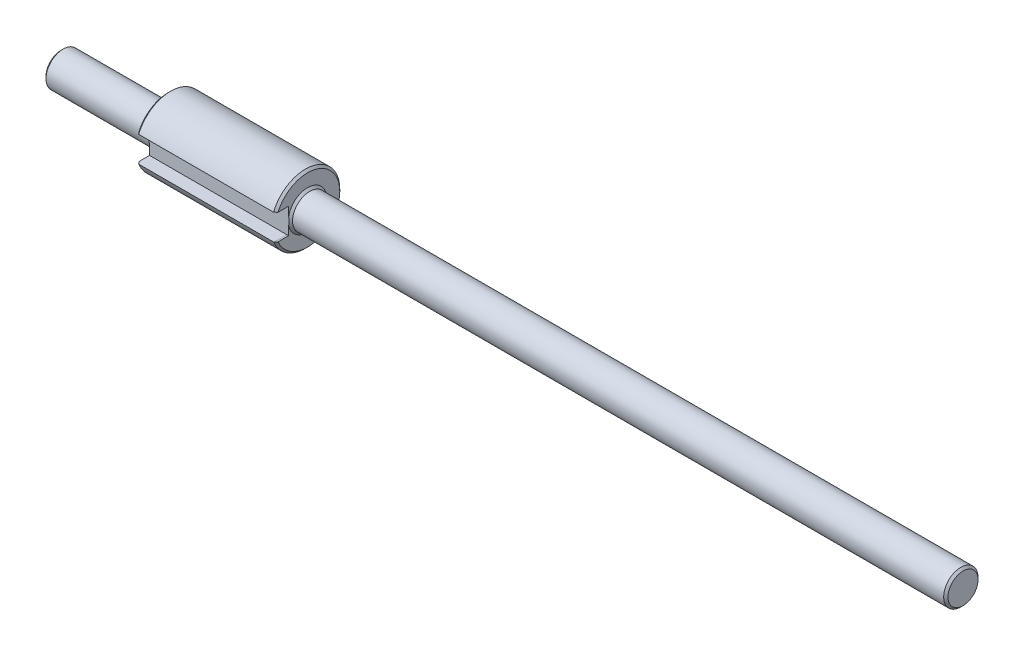
ISO-10303-21;
HEADER;
FILE_DESCRIPTION(('STEP AP214'),'2;1');
FILE_NAME('part.step','',(''),(''),'','','');
FILE_SCHEMA(('AUTOMOTIVE_DESIGN { 1 0 10303 214 1 1 1 1 }'));
ENDSEC;
DATA;
#1=APPLICATION_CONTEXT('core data for automotive mechanical design processes');
#2=APPLICATION_PROTOCOL_DEFINITION('international standard','automotive_design',2000,#1);
#3=PRODUCT_CONTEXT('',#1,'mechanical');
#4=PRODUCT('Part','Part','',(#3));
#5=PRODUCT_RELATED_PRODUCT_CATEGORY('part','',(#4));
#6=PRODUCT_DEFINITION_FORMATION('','',#4);
#7=PRODUCT_DEFINITION_CONTEXT('part definition',#1,'design');
#8=PRODUCT_DEFINITION('design','',#6,#7);
#9=PRODUCT_DEFINITION_SHAPE('','',#8);
#10=(LENGTH_UNIT() NAMED_UNIT(*) SI_UNIT(.MILLI.,.METRE.));
#11=(NAMED_UNIT(*) PLANE_ANGLE_UNIT() SI_UNIT($,.RADIAN.));
#12=(NAMED_UNIT(*) SI_UNIT($,.STERADIAN.) SOLID_ANGLE_UNIT());
#13=UNCERTAINTY_MEASURE_WITH_UNIT(LENGTH_MEASURE(1.E-05),#10,'distance_accuracy_value','');
#14=(GEOMETRIC_REPRESENTATION_CONTEXT(3) GLOBAL_UNCERTAINTY_ASSIGNED_CONTEXT((#13)) GLOBAL_UNIT_ASSIGNED_CONTEXT((#10,
#11,#12)) REPRESENTATION_CONTEXT('',''));
#15=CARTESIAN_POINT('',(0.,0.,0.));
#16=DIRECTION('',(0.,0.,1.));
#17=DIRECTION('',(1.,0.,0.));
#18=AXIS2_PLACEMENT_3D('',#15,#16,#17);
#19=CARTESIAN_POINT('',(11.5,0.,2.2));
#20=DIRECTION('',(0.,0.,1.));
#21=DIRECTION('',(1.,0.,0.));
#22=AXIS2_PLACEMENT_3D('',#19,#20,#21);
#23=PLANE('',#22);
#24=DIRECTION('',(-1.,0.,0.));
#25=VECTOR('',#24,1.);
#26=CARTESIAN_POINT('',(28.5,1.5,2.2));
#27=LINE('',#26,#25);
#28=CARTESIAN_POINT('',(28.5,1.5,2.2));
#29=VERTEX_POINT('',#28);
#30=CARTESIAN_POINT('',(12.5,1.5,2.2));
#31=VERTEX_POINT('',#30);
#32=EDGE_CURVE('E207',#29,#31,#27,.T.);
#33=ORIENTED_EDGE('',*,*,#32,.T.);
#34=DIRECTION('',(0.,-1.,0.));
#35=VECTOR('',#34,1.);
#36=CARTESIAN_POINT('',(12.5,0.,2.2));
#37=LINE('',#36,#35);
#38=CARTESIAN_POINT('',(12.5,0.471699056602839,2.2));
#39=VERTEX_POINT('',#38);
#40=EDGE_CURVE('E177',#31,#39,#37,.T.);
#41=ORIENTED_EDGE('',*,*,#40,.T.);
#42=CARTESIAN_POINT('',(12.5,0.471699056602839,2.2));
#43=CARTESIAN_POINT('',(12.4884661641308,0.416797253813431,2.2));
#44=CARTESIAN_POINT('',(12.4788132845891,0.36148243843863,2.2));
#45=CARTESIAN_POINT('',(12.4635114340834,0.250276403978719,2.2));
#46=CARTESIAN_POINT('',(12.4578644414236,0.194384913906684,2.2));
#47=CARTESIAN_POINT('',(12.4508818824775,0.0831843134871501,2.2));
#48=CARTESIAN_POINT('',(12.4494818797254,0.0278793202469923,2.2));
#49=CARTESIAN_POINT('',(12.4508590342781,-0.0826530499453649,2.2));
#50=CARTESIAN_POINT('',(12.453634210324,-0.13788045127162,2.2));
#51=CARTESIAN_POINT('',(12.4625202874015,-0.239598348395322,2.2));
#52=CARTESIAN_POINT('',(12.4680597454246,-0.286140311064404,2.2));
#53=CARTESIAN_POINT('',(12.4819478803714,-0.379117623241041,2.2));
#54=CARTESIAN_POINT('',(12.4903147919314,-0.425550258810649,2.2));
#55=CARTESIAN_POINT('',(12.5,-0.471699056602839,2.2));
#56=B_SPLINE_CURVE_WITH_KNOTS('',3,(#42,#43,#44,#45,#46,#47,#48,#49,#50,#51,#52,#53,#54,#55),
.UNSPECIFIED.,.F.,.F.,(4,2,2,2,2,2,4),(0.,0.168294691823436,0.336672438105486,0.502482403731017,
0.668213711920876,0.808742158040954,0.950194758246139),.UNSPECIFIED.);
#57=CARTESIAN_POINT('',(12.5,-0.471699056602839,2.2));
#58=VERTEX_POINT('',#57);
#59=EDGE_CURVE('E11',#39,#58,#56,.T.);
#60=ORIENTED_EDGE('',*,*,#59,.T.);
#61=CARTESIAN_POINT('',(12.5,-1.5,2.2));
#62=VERTEX_POINT('',#61);
#63=EDGE_CURVE('E141',#58,#62,#37,.T.);
#64=ORIENTED_EDGE('',*,*,#63,.T.);
#65=DIRECTION('',(1.,0.,0.));
#66=VECTOR('',#65,1.);
#67=CARTESIAN_POINT('',(11.5,-1.5,2.2));
#68=LINE('',#67,#66);
#69=CARTESIAN_POINT('',(28.5,-1.5,2.2));
#70=VERTEX_POINT('',#69);
#71=EDGE_CURVE('E157',#62,#70,#68,.T.);
#72=ORIENTED_EDGE('',*,*,#71,.T.);
#73=CARTESIAN_POINT('',(28.5,0.,2.2));
#74=DIRECTION('',(0.,0.,1.));
#75=DIRECTION('',(0.,-1.,0.));
#76=AXIS2_PLACEMENT_3D('',#73,#74,#75);
#77=CIRCLE('',#76,1.5);
#78=CARTESIAN_POINT('',(28.7,-1.48660687473185,2.2));
#79=VERTEX_POINT('',#78);
#80=EDGE_CURVE('E148',#70,#79,#77,.T.);
#81=ORIENTED_EDGE('',*,*,#80,.T.);
#82=DIRECTION('',(0.,1.,0.));
#83=VECTOR('',#82,1.);
#84=CARTESIAN_POINT('',(28.7,0.,2.2));
#85=LINE('',#84,#83);
#86=CARTESIAN_POINT('',(28.7,-0.471699056602906,2.2));
#87=VERTEX_POINT('',#86);
#88=EDGE_CURVE('E133',#79,#87,#85,.T.);
#89=ORIENTED_EDGE('',*,*,#88,.T.);
#90=CARTESIAN_POINT('',(28.7,-0.471699056602906,2.2));
#91=CARTESIAN_POINT('',(28.7115338358692,-0.416797253813498,2.2));
#92=CARTESIAN_POINT('',(28.7211867154109,-0.361482438438698,2.2));
#93=CARTESIAN_POINT('',(28.7364885659166,-0.250276403978788,2.2));
#94=CARTESIAN_POINT('',(28.7421355585764,-0.194384913906754,2.2));
#95=CARTESIAN_POINT('',(28.7491181175225,-0.0831843134872213,2.2));
#96=CARTESIAN_POINT('',(28.7505181202746,-0.0278793202470641,2.2));
#97=CARTESIAN_POINT('',(28.7491409657219,0.0826530499452922,2.2));
#98=CARTESIAN_POINT('',(28.746365789676,0.137880451271547,2.2));
#99=CARTESIAN_POINT('',(28.7374797125985,0.239598348395272,2.2));
#100=CARTESIAN_POINT('',(28.7319402545755,0.286140311064377,2.2));
#101=CARTESIAN_POINT('',(28.7180521196287,0.379117623241061,2.2));
#102=CARTESIAN_POINT('',(28.7096852080686,0.425550258810693,2.2));
#103=CARTESIAN_POINT('',(28.7,0.471699056602905,2.2));
#104=B_SPLINE_CURVE_WITH_KNOTS('',3,(#90,#91,#92,#93,#94,#95,#96,#97,#98,#99,#100,#101,#102,
#103),.UNSPECIFIED.,.F.,.F.,(4,2,2,2,2,2,4),(0.,0.168294691823434,0.336672438105483,
0.502482403731012,0.66821371192087,0.808742158041018,0.950194758246274),.UNSPECIFIED.);
#105=CARTESIAN_POINT('',(28.7,0.471699056602906,2.2));
#106=VERTEX_POINT('',#105);
#107=EDGE_CURVE('E68',#87,#106,#104,.T.);
#108=ORIENTED_EDGE('',*,*,#107,.T.);
#109=CARTESIAN_POINT('',(28.7,1.48660687473185,2.2));
#110=VERTEX_POINT('',#109);
#111=EDGE_CURVE('E142',#106,#110,#85,.T.);
#112=ORIENTED_EDGE('',*,*,#111,.T.);
#113=EDGE_CURVE('E160',#110,#29,#77,.T.);
#114=ORIENTED_EDGE('',*,*,#113,.T.);
#115=EDGE_LOOP('',(#33,#41,#60,#64,#72,#81,#89,#108,#112,#114));
#116=FACE_BOUND('',#115,.T.);
#117=ADVANCED_FACE('F53',(#116),#23,.T.);
#118=CARTESIAN_POINT('',(11.5,-1.5,2.2));
#119=DIRECTION('',(0.,-1.,0.));
#120=DIRECTION('',(0.,0.,-1.));
#121=AXIS2_PLACEMENT_3D('',#118,#119,#120);
#122=PLANE('',#121);
#123=DIRECTION('',(0.,0.,-1.));
#124=VECTOR('',#123,1.);
#125=CARTESIAN_POINT('',(12.5,-1.5,2.2));
#126=LINE('',#125,#124);
#127=CARTESIAN_POINT('',(12.5,-1.5,3.43693177121689));
#128=VERTEX_POINT('',#127);
#129=EDGE_CURVE('E298',#128,#62,#126,.T.);
#130=ORIENTED_EDGE('',*,*,#129,.F.);
#131=CARTESIAN_POINT('',(12.5,-1.5,3.43693177121689));
#132=CARTESIAN_POINT('',(12.5415384275323,-1.5,3.48224458408976));
#133=CARTESIAN_POINT('',(12.5831409759889,-1.5,3.52749828135071));
#134=CARTESIAN_POINT('',(12.6664743093389,-1.5,3.617887438779));
#135=CARTESIAN_POINT('',(12.7082050942156,-1.5,3.6630228989617));
#136=CARTESIAN_POINT('',(12.75,-1.5,3.70809924354783));
#137=B_SPLINE_CURVE_WITH_KNOTS('',3,(#131,#132,#133,#134,#135,#136),.UNSPECIFIED.,.F.,.F.,(4,2,
4),(0.,0.184412641607853,0.368825259264644),.UNSPECIFIED.);
#138=CARTESIAN_POINT('',(12.75,-1.5,3.70809924354783));
#139=VERTEX_POINT('',#138);
#140=EDGE_CURVE('E313',#128,#139,#137,.T.);
#141=ORIENTED_EDGE('',*,*,#140,.T.);
#142=DIRECTION('',(-1.,0.,0.));
#143=VECTOR('',#142,1.);
#144=CARTESIAN_POINT('',(28.5,-1.5,3.70809924354783));
#145=LINE('',#144,#143);
#146=CARTESIAN_POINT('',(28.45,-1.5,3.70809924354783));
#147=VERTEX_POINT('',#146);
#148=EDGE_CURVE('E202',#147,#139,#145,.T.);
#149=ORIENTED_EDGE('',*,*,#148,.F.);
#150=CARTESIAN_POINT('',(28.45,-1.5,3.70809924354783));
#151=CARTESIAN_POINT('',(28.4583380184143,-1.5,3.69910492133361));
#152=CARTESIAN_POINT('',(28.4666736942864,-1.5,3.69010842977599));
#153=CARTESIAN_POINT('',(28.4833403609531,-1.5,3.67211110796629));
#154=CARTESIAN_POINT('',(28.4916713517477,-1.5,3.66311027771419));
#155=CARTESIAN_POINT('',(28.5,-1.5,3.65410727811869));
#156=B_SPLINE_CURVE_WITH_KNOTS('',3,(#150,#151,#152,#153,#154,#155),.UNSPECIFIED.,.F.,.F.,(4,2,
4),(0.,0.0367937925921365,0.0735875852156391),.UNSPECIFIED.);
#157=CARTESIAN_POINT('',(28.5,-1.5,3.65410727811869));
#158=VERTEX_POINT('',#157);
#159=EDGE_CURVE('E201',#147,#158,#156,.T.);
#160=ORIENTED_EDGE('',*,*,#159,.T.);
#161=DIRECTION('',(0.,0.,1.));
#162=VECTOR('',#161,1.);
#163=CARTESIAN_POINT('',(28.5,-1.5,2.2));
#164=LINE('',#163,#162);
#165=EDGE_CURVE('E159',#70,#158,#164,.T.);
#166=ORIENTED_EDGE('',*,*,#165,.F.);
#167=ORIENTED_EDGE('',*,*,#71,.F.);
#168=EDGE_LOOP('',(#130,#141,#149,#160,#166,#167));
#169=FACE_BOUND('',#168,.T.);
#170=ADVANCED_FACE('F277',(#169),#122,.F.);
#171=CARTESIAN_POINT('',(28.5,0.,2.2));
#172=DIRECTION('',(0.,0.,1.));
#173=DIRECTION('',(1.,0.,0.));
#174=AXIS2_PLACEMENT_3D('',#171,#172,#173);
#175=CYLINDRICAL_SURFACE('',#174,1.5);
#176=ORIENTED_EDGE('',*,*,#165,.T.);
#177=CARTESIAN_POINT('',(28.5,-1.5,3.65410727811869));
#178=CARTESIAN_POINT('',(28.5329907330003,-1.50003032288012,3.6184128373353));
#179=CARTESIAN_POINT('',(28.5661527686115,-1.49892939022159,3.58295217432913));
#180=CARTESIAN_POINT('',(28.6328194353776,-1.49446501447532,3.51249841409878));
#181=CARTESIAN_POINT('',(28.6663240664331,-1.49110157204447,3.47750531673885));
#182=CARTESIAN_POINT('',(28.7,-1.48660687473185,3.4427459970204));
#183=B_SPLINE_CURVE_WITH_KNOTS('',3,(#177,#178,#179,#180,#181,#182),.UNSPECIFIED.,.F.,.F.,(4,2,
4),(0.,0.145689812666751,0.291379583034976),.UNSPECIFIED.);
#184=CARTESIAN_POINT('',(28.7,-1.48660687473185,3.4427459970204));
#185=VERTEX_POINT('',#184);
#186=EDGE_CURVE('E151',#158,#185,#183,.T.);
#187=ORIENTED_EDGE('',*,*,#186,.T.);
#188=DIRECTION('',(0.,0.,1.));
#189=VECTOR('',#188,1.);
#190=CARTESIAN_POINT('',(28.7,-1.48660687473185,2.2));
#191=LINE('',#190,#189);
#192=EDGE_CURVE('E136',#79,#185,#191,.T.);
#193=ORIENTED_EDGE('',*,*,#192,.F.);
#194=ORIENTED_EDGE('',*,*,#80,.F.);
#195=EDGE_LOOP('',(#176,#187,#193,#194));
#196=FACE_BOUND('',#195,.T.);
#197=ADVANCED_FACE('F147',(#196),#175,.F.);
#198=DIRECTION('',(0.,0.,1.));
#199=VECTOR('',#198,1.);
#200=CARTESIAN_POINT('',(28.7,1.48660687473185,2.2));
#201=LINE('',#200,#199);
#202=CARTESIAN_POINT('',(28.7,1.48660687473185,3.4427459970204));
#203=VERTEX_POINT('',#202);
#204=EDGE_CURVE('E153',#203,#110,#201,.F.);
#205=ORIENTED_EDGE('',*,*,#204,.F.);
#206=CARTESIAN_POINT('',(28.7,1.48660687473185,3.4427459970204));
#207=CARTESIAN_POINT('',(28.6663240664331,1.49110157204447,3.47750531673885));
#208=CARTESIAN_POINT('',(28.6328194353776,1.49446501447532,3.51249841409878));
#209=CARTESIAN_POINT('',(28.5661527686115,1.49892939022159,3.58295217432913));
#210=CARTESIAN_POINT('',(28.5329907330003,1.50003032288012,3.6184128373353));
#211=CARTESIAN_POINT('',(28.5,1.5,3.65410727811869));
#212=B_SPLINE_CURVE_WITH_KNOTS('',3,(#206,#207,#208,#209,#210,#211),.UNSPECIFIED.,.F.,.F.,(4,2,
4),(0.,0.145689770368225,0.291379583034976),.UNSPECIFIED.);
#213=CARTESIAN_POINT('',(28.5,1.5,3.65410727811869));
#214=VERTEX_POINT('',#213);
#215=EDGE_CURVE('E241',#203,#214,#212,.T.);
#216=ORIENTED_EDGE('',*,*,#215,.T.);
#217=DIRECTION('',(0.,0.,1.));
#218=VECTOR('',#217,1.);
#219=CARTESIAN_POINT('',(28.5,1.5,2.2));
#220=LINE('',#219,#218);
#221=EDGE_CURVE('E165',#29,#214,#220,.T.);
#222=ORIENTED_EDGE('',*,*,#221,.F.);
#223=ORIENTED_EDGE('',*,*,#113,.F.);
#224=EDGE_LOOP('',(#205,#216,#222,#223));
#225=FACE_BOUND('',#224,.T.);
#226=ADVANCED_FACE('F272',(#225),#175,.F.);
#227=CARTESIAN_POINT('',(28.5,1.5,2.2));
#228=DIRECTION('',(0.,1.,0.));
#229=DIRECTION('',(0.,0.,1.));
#230=AXIS2_PLACEMENT_3D('',#227,#228,#229);
#231=PLANE('',#230);
#232=DIRECTION('',(1.,0.,0.));
#233=VECTOR('',#232,1.);
#234=CARTESIAN_POINT('',(11.5,1.5,3.70809924354783));
#235=LINE('',#234,#233);
#236=CARTESIAN_POINT('',(12.75,1.5,3.70809924354783));
#237=VERTEX_POINT('',#236);
#238=CARTESIAN_POINT('',(28.45,1.5,3.70809924354783));
#239=VERTEX_POINT('',#238);
#240=EDGE_CURVE('E208',#237,#239,#235,.T.);
#241=ORIENTED_EDGE('',*,*,#240,.F.);
#242=CARTESIAN_POINT('',(12.75,1.5,3.70809924354783));
#243=CARTESIAN_POINT('',(12.7082050942156,1.5,3.6630228989617));
#244=CARTESIAN_POINT('',(12.6664743093389,1.5,3.617887438779));
#245=CARTESIAN_POINT('',(12.5831409759889,1.5,3.52749828135071));
#246=CARTESIAN_POINT('',(12.5415384275323,1.5,3.48224458408976));
#247=CARTESIAN_POINT('',(12.5,1.5,3.43693177121689));
#248=B_SPLINE_CURVE_WITH_KNOTS('',3,(#242,#243,#244,#245,#246,#247),.UNSPECIFIED.,.F.,.F.,(4,2,
4),(0.,0.184412617656791,0.368825259264644),.UNSPECIFIED.);
#249=CARTESIAN_POINT('',(12.5,1.5,3.43693177121689));
#250=VERTEX_POINT('',#249);
#251=EDGE_CURVE('E245',#237,#250,#248,.T.);
#252=ORIENTED_EDGE('',*,*,#251,.T.);
#253=DIRECTION('',(0.,0.,1.));
#254=VECTOR('',#253,1.);
#255=CARTESIAN_POINT('',(12.5,1.5,2.2));
#256=LINE('',#255,#254);
#257=EDGE_CURVE('E305',#31,#250,#256,.T.);
#258=ORIENTED_EDGE('',*,*,#257,.F.);
#259=ORIENTED_EDGE('',*,*,#32,.F.);
#260=ORIENTED_EDGE('',*,*,#221,.T.);
#261=CARTESIAN_POINT('',(28.5,1.5,3.65410727811869));
#262=CARTESIAN_POINT('',(28.4916713517477,1.5,3.66311027771419));
#263=CARTESIAN_POINT('',(28.4833403609531,1.5,3.67211110796629));
#264=CARTESIAN_POINT('',(28.4666736942864,1.5,3.69010842977599));
#265=CARTESIAN_POINT('',(28.4583380184143,1.5,3.69910492133361));
#266=CARTESIAN_POINT('',(28.45,1.5,3.70809924354783));
#267=B_SPLINE_CURVE_WITH_KNOTS('',3,(#261,#262,#263,#264,#265,#266),.UNSPECIFIED.,.F.,.F.,(4,2,
4),(0.,0.0367937926235023,0.0735875852156375),.UNSPECIFIED.);
#268=EDGE_CURVE('E232',#214,#239,#267,.T.);
#269=ORIENTED_EDGE('',*,*,#268,.T.);
#270=EDGE_LOOP('',(#241,#252,#258,#259,#260,#269));
#271=FACE_BOUND('',#270,.T.);
#272=ADVANCED_FACE('F231',(#271),#231,.F.);
#273=CARTESIAN_POINT('',(105.,0.,0.));
#274=DIRECTION('',(1.,0.,0.));
#275=DIRECTION('',(0.,0.,-1.));
#276=AXIS2_PLACEMENT_3D('',#273,#274,#275);
#277=CYLINDRICAL_SURFACE('',#276,4.);
#278=ORIENTED_EDGE('',*,*,#148,.T.);
#279=CARTESIAN_POINT('',(12.75,0.,0.));
#280=DIRECTION('',(-1.,0.,0.));
#281=DIRECTION('',(0.,0.,1.));
#282=AXIS2_PLACEMENT_3D('',#279,#280,#281);
#283=CIRCLE('',#282,4.);
#284=EDGE_CURVE('E246',#139,#237,#283,.F.);
#285=ORIENTED_EDGE('',*,*,#284,.T.);
#286=ORIENTED_EDGE('',*,*,#240,.T.);
#287=CARTESIAN_POINT('',(28.45,0.,0.));
#288=DIRECTION('',(1.,0.,0.));
#289=DIRECTION('',(0.,0.,-1.));
#290=AXIS2_PLACEMENT_3D('',#287,#288,#289);
#291=CIRCLE('',#290,4.);
#292=EDGE_CURVE('E243',#239,#147,#291,.F.);
#293=ORIENTED_EDGE('',*,*,#292,.T.);
#294=EDGE_LOOP('',(#278,#285,#286,#293));
#295=FACE_BOUND('',#294,.T.);
#296=ADVANCED_FACE('F271',(#295),#277,.T.);
#297=CARTESIAN_POINT('',(28.7,4.,0.));
#298=DIRECTION('',(1.,0.,0.));
#299=DIRECTION('',(0.,0.,-1.));
#300=AXIS2_PLACEMENT_3D('',#297,#298,#299);
#301=PLANE('',#300);
#302=ORIENTED_EDGE('',*,*,#192,.T.);
#303=CARTESIAN_POINT('',(28.7,0.,0.));
#304=DIRECTION('',(1.,0.,0.));
#305=DIRECTION('',(0.,0.,-1.));
#306=AXIS2_PLACEMENT_3D('',#303,#304,#305);
#307=CIRCLE('',#306,3.75);
#308=EDGE_CURVE('E324',#185,#203,#307,.T.);
#309=ORIENTED_EDGE('',*,*,#308,.T.);
#310=ORIENTED_EDGE('',*,*,#204,.T.);
#311=ORIENTED_EDGE('',*,*,#111,.F.);
#312=CARTESIAN_POINT('',(28.7,0.,0.));
#313=DIRECTION('',(1.,0.,0.));
#314=DIRECTION('',(0.,0.,-1.));
#315=AXIS2_PLACEMENT_3D('',#312,#313,#314);
#316=CIRCLE('',#315,2.25000000000002);
#317=EDGE_CURVE('E138',#106,#87,#316,.F.);
#318=ORIENTED_EDGE('',*,*,#317,.T.);
#319=ORIENTED_EDGE('',*,*,#88,.F.);
#320=EDGE_LOOP('',(#302,#309,#310,#311,#318,#319));
#321=FACE_BOUND('',#320,.T.);
#322=ADVANCED_FACE('F135',(#321),#301,.T.);
#323=CARTESIAN_POINT('',(0.,0.,0.));
#324=DIRECTION('',(-1.,0.,0.));
#325=DIRECTION('',(0.,0.,1.));
#326=AXIS2_PLACEMENT_3D('',#323,#324,#325);
#327=CYLINDRICAL_SURFACE('',#326,2.);
#328=CARTESIAN_POINT('',(104.75,0.,0.));
#329=DIRECTION('',(-1.,0.,0.));
#330=DIRECTION('',(0.,0.,1.));
#331=AXIS2_PLACEMENT_3D('',#328,#329,#330);
#332=CIRCLE('',#331,2.);
#333=CARTESIAN_POINT('',(104.75,0.,2.));
#334=VERTEX_POINT('',#333);
#335=EDGE_CURVE('E185',#334,#334,#332,.T.);
#336=ORIENTED_EDGE('',*,*,#335,.T.);
#337=EDGE_LOOP('',(#336));
#338=FACE_BOUND('',#337,.T.);
#339=CARTESIAN_POINT('',(28.95,0.,0.));
#340=DIRECTION('',(1.,0.,0.));
#341=DIRECTION('',(0.,0.,-1.));
#342=AXIS2_PLACEMENT_3D('',#339,#340,#341);
#343=CIRCLE('',#342,2.);
#344=CARTESIAN_POINT('',(28.95,0.,-2.));
#345=VERTEX_POINT('',#344);
#346=EDGE_CURVE('E181',#345,#345,#343,.T.);
#347=ORIENTED_EDGE('',*,*,#346,.T.);
#348=EDGE_LOOP('',(#347));
#349=FACE_BOUND('',#348,.T.);
#350=ADVANCED_FACE('F385',(#338,#349),#327,.T.);
#351=CARTESIAN_POINT('',(12.5,2.,0.));
#352=DIRECTION('',(-1.,0.,0.));
#353=DIRECTION('',(0.,0.,1.));
#354=AXIS2_PLACEMENT_3D('',#351,#352,#353);
#355=PLANE('',#354);
#356=ORIENTED_EDGE('',*,*,#257,.T.);
#357=CARTESIAN_POINT('',(12.5,0.,0.));
#358=DIRECTION('',(-1.,0.,0.));
#359=DIRECTION('',(0.,0.,1.));
#360=AXIS2_PLACEMENT_3D('',#357,#358,#359);
#361=CIRCLE('',#360,3.75000000000001);
#362=EDGE_CURVE('E197',#250,#128,#361,.T.);
#363=ORIENTED_EDGE('',*,*,#362,.T.);
#364=ORIENTED_EDGE('',*,*,#129,.T.);
#365=ORIENTED_EDGE('',*,*,#63,.F.);
#366=CARTESIAN_POINT('',(12.5,0.,0.));
#367=DIRECTION('',(-1.,0.,0.));
#368=DIRECTION('',(0.,0.,1.));
#369=AXIS2_PLACEMENT_3D('',#366,#367,#368);
#370=CIRCLE('',#369,2.25);
#371=EDGE_CURVE('E193',#58,#39,#370,.F.);
#372=ORIENTED_EDGE('',*,*,#371,.T.);
#373=ORIENTED_EDGE('',*,*,#40,.F.);
#374=EDGE_LOOP('',(#356,#363,#364,#365,#372,#373));
#375=FACE_BOUND('',#374,.T.);
#376=ADVANCED_FACE('F387',(#375),#355,.T.);
#377=CARTESIAN_POINT('',(0.,0.,0.));
#378=DIRECTION('',(-1.,0.,0.));
#379=DIRECTION('',(0.,0.,1.));
#380=AXIS2_PLACEMENT_3D('',#377,#378,#379);
#381=CYLINDRICAL_SURFACE('',#380,2.);
#382=CARTESIAN_POINT('',(12.25,0.,0.));
#383=DIRECTION('',(-1.,0.,0.));
#384=DIRECTION('',(0.,0.,1.));
#385=AXIS2_PLACEMENT_3D('',#382,#383,#384);
#386=CIRCLE('',#385,2.);
#387=CARTESIAN_POINT('',(12.25,0.,2.));
#388=VERTEX_POINT('',#387);
#389=EDGE_CURVE('E332',#388,#388,#386,.T.);
#390=ORIENTED_EDGE('',*,*,#389,.T.);
#391=EDGE_LOOP('',(#390));
#392=FACE_BOUND('',#391,.T.);
#393=CARTESIAN_POINT('',(0.250000000000005,0.,0.));
#394=DIRECTION('',(1.,0.,0.));
#395=DIRECTION('',(0.,0.,-1.));
#396=AXIS2_PLACEMENT_3D('',#393,#394,#395);
#397=CIRCLE('',#396,2.);
#398=CARTESIAN_POINT('',(0.250000000000005,0.,-2.));
#399=VERTEX_POINT('',#398);
#400=EDGE_CURVE('E329',#399,#399,#397,.T.);
#401=ORIENTED_EDGE('',*,*,#400,.T.);
#402=EDGE_LOOP('',(#401));
#403=FACE_BOUND('',#402,.T.);
#404=ADVANCED_FACE('F394',(#392,#403),#381,.T.);
#405=CARTESIAN_POINT('',(105.,3.5,0.));
#406=DIRECTION('',(-1.,0.,0.));
#407=DIRECTION('',(0.,0.,1.));
#408=AXIS2_PLACEMENT_3D('',#405,#406,#407);
#409=PLANE('',#408);
#410=CARTESIAN_POINT('',(105.,0.,0.));
#411=DIRECTION('',(-1.,0.,0.));
#412=DIRECTION('',(0.,0.,1.));
#413=AXIS2_PLACEMENT_3D('',#410,#411,#412);
#414=CIRCLE('',#413,1.74999999999996);
#415=CARTESIAN_POINT('',(105.,0.,1.74999999999996));
#416=VERTEX_POINT('',#415);
#417=EDGE_CURVE('E189',#416,#416,#414,.F.);
#418=ORIENTED_EDGE('',*,*,#417,.T.);
#419=EDGE_LOOP('',(#418));
#420=FACE_BOUND('',#419,.T.);
#421=ADVANCED_FACE('F353',(#420),#409,.F.);
#422=CARTESIAN_POINT('',(0.,0.,0.));
#423=DIRECTION('',(1.,0.,0.));
#424=DIRECTION('',(0.,0.,-1.));
#425=AXIS2_PLACEMENT_3D('',#422,#423,#424);
#426=PLANE('',#425);
#427=CARTESIAN_POINT('',(0.,0.,0.));
#428=DIRECTION('',(1.,0.,0.));
#429=DIRECTION('',(0.,0.,-1.));
#430=AXIS2_PLACEMENT_3D('',#427,#428,#429);
#431=CIRCLE('',#430,1.75);
#432=CARTESIAN_POINT('',(0.,0.,-1.75));
#433=VERTEX_POINT('',#432);
#434=EDGE_CURVE('E337',#433,#433,#431,.F.);
#435=ORIENTED_EDGE('',*,*,#434,.T.);
#436=EDGE_LOOP('',(#435));
#437=FACE_BOUND('',#436,.T.);
#438=ADVANCED_FACE('F362',(#437),#426,.F.);
#439=CARTESIAN_POINT('',(104.75,0.,0.));
#440=DIRECTION('',(-1.,0.,0.));
#441=DIRECTION('',(0.,0.,1.));
#442=AXIS2_PLACEMENT_3D('',#439,#440,#441);
#443=CONICAL_SURFACE('',#442,2.,0.785398163397473);
#444=ORIENTED_EDGE('',*,*,#417,.F.);
#445=EDGE_LOOP('',(#444));
#446=FACE_BOUND('',#445,.T.);
#447=ORIENTED_EDGE('',*,*,#335,.F.);
#448=EDGE_LOOP('',(#447));
#449=FACE_BOUND('',#448,.T.);
#450=ADVANCED_FACE('F355',(#446,#449),#443,.T.);
#451=CARTESIAN_POINT('',(12.5,0.,0.));
#452=DIRECTION('',(1.,0.,0.));
#453=DIRECTION('',(0.,0.,-1.));
#454=AXIS2_PLACEMENT_3D('',#451,#452,#453);
#455=CONICAL_SURFACE('',#454,3.75,0.785398163397414);
#456=ORIENTED_EDGE('',*,*,#251,.F.);
#457=ORIENTED_EDGE('',*,*,#284,.F.);
#458=ORIENTED_EDGE('',*,*,#140,.F.);
#459=ORIENTED_EDGE('',*,*,#362,.F.);
#460=EDGE_LOOP('',(#456,#457,#458,#459));
#461=FACE_BOUND('',#460,.T.);
#462=ADVANCED_FACE('F361',(#461),#455,.T.);
#463=CARTESIAN_POINT('',(28.45,0.,0.));
#464=DIRECTION('',(-1.,0.,0.));
#465=DIRECTION('',(0.,0.,1.));
#466=AXIS2_PLACEMENT_3D('',#463,#464,#465);
#467=CONICAL_SURFACE('',#466,4.,0.785398163397449);
#468=ORIENTED_EDGE('',*,*,#215,.F.);
#469=ORIENTED_EDGE('',*,*,#308,.F.);
#470=ORIENTED_EDGE('',*,*,#186,.F.);
#471=ORIENTED_EDGE('',*,*,#159,.F.);
#472=ORIENTED_EDGE('',*,*,#292,.F.);
#473=ORIENTED_EDGE('',*,*,#268,.F.);
#474=EDGE_LOOP('',(#468,#469,#470,#471,#472,#473));
#475=FACE_BOUND('',#474,.T.);
#476=ADVANCED_FACE('F240',(#475),#467,.T.);
#477=CARTESIAN_POINT('',(28.7,0.,0.));
#478=DIRECTION('',(-1.,0.,0.));
#479=DIRECTION('',(0.,0.,1.));
#480=AXIS2_PLACEMENT_3D('',#477,#478,#479);
#481=CONICAL_SURFACE('',#480,2.25000000000002,0.785398163397466);
#482=ORIENTED_EDGE('',*,*,#346,.F.);
#483=EDGE_LOOP('',(#482));
#484=FACE_BOUND('',#483,.T.);
#485=ORIENTED_EDGE('',*,*,#107,.F.);
#486=ORIENTED_EDGE('',*,*,#317,.F.);
#487=EDGE_LOOP('',(#485,#486));
#488=FACE_BOUND('',#487,.T.);
#489=ADVANCED_FACE('F348',(#484,#488),#481,.T.);
#490=CARTESIAN_POINT('',(12.25,0.,0.));
#491=DIRECTION('',(1.,0.,0.));
#492=DIRECTION('',(0.,0.,-1.));
#493=AXIS2_PLACEMENT_3D('',#490,#491,#492);
#494=CONICAL_SURFACE('',#493,2.,0.785398163397434);
#495=ORIENTED_EDGE('',*,*,#59,.F.);
#496=ORIENTED_EDGE('',*,*,#371,.F.);
#497=EDGE_LOOP('',(#495,#496));
#498=FACE_BOUND('',#497,.T.);
#499=ORIENTED_EDGE('',*,*,#389,.F.);
#500=EDGE_LOOP('',(#499));
#501=FACE_BOUND('',#500,.T.);
#502=ADVANCED_FACE('F377',(#498,#501),#494,.T.);
#503=CARTESIAN_POINT('',(0.,0.,0.));
#504=DIRECTION('',(1.,0.,0.));
#505=DIRECTION('',(0.,0.,-1.));
#506=AXIS2_PLACEMENT_3D('',#503,#504,#505);
#507=CONICAL_SURFACE('',#506,1.75,0.785398163397434);
#508=ORIENTED_EDGE('',*,*,#400,.F.);
#509=EDGE_LOOP('',(#508));
#510=FACE_BOUND('',#509,.T.);
#511=ORIENTED_EDGE('',*,*,#434,.F.);
#512=EDGE_LOOP('',(#511));
#513=FACE_BOUND('',#512,.T.);
#514=ADVANCED_FACE('F56',(#510,#513),#507,.T.);
#515=CLOSED_SHELL('',(#117,#170,#197,#226,#272,#296,#322,#350,#376,#404,#421,#438,#450,#462,
#476,#489,#502,#514));
#516=MANIFOLD_SOLID_BREP('B2',#515);
#517=ADVANCED_BREP_SHAPE_REPRESENTATION('',(#18,#516),#14);
#518=SHAPE_DEFINITION_REPRESENTATION(#9,#517);
ENDSEC;
END-ISO-10303-21;
